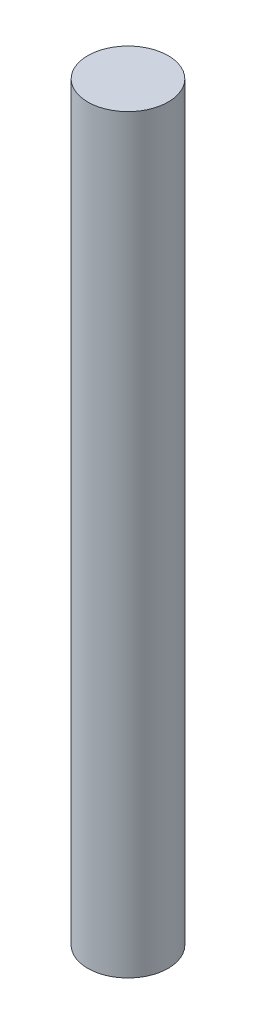
ISO-10303-21;
HEADER;
FILE_DESCRIPTION(('STEP AP214'),'2;1');
FILE_NAME('part.step','',(''),(''),'','','');
FILE_SCHEMA(('AUTOMOTIVE_DESIGN { 1 0 10303 214 1 1 1 1 }'));
ENDSEC;
DATA;
#1=APPLICATION_CONTEXT('core data for automotive mechanical design processes');
#2=APPLICATION_PROTOCOL_DEFINITION('international standard','automotive_design',2000,#1);
#3=PRODUCT_CONTEXT('',#1,'mechanical');
#4=PRODUCT('Part','Part','',(#3));
#5=PRODUCT_RELATED_PRODUCT_CATEGORY('part','',(#4));
#6=PRODUCT_DEFINITION_FORMATION('','',#4);
#7=PRODUCT_DEFINITION_CONTEXT('part definition',#1,'design');
#8=PRODUCT_DEFINITION('design','',#6,#7);
#9=PRODUCT_DEFINITION_SHAPE('','',#8);
#10=(LENGTH_UNIT() NAMED_UNIT(*) SI_UNIT(.MILLI.,.METRE.));
#11=(NAMED_UNIT(*) PLANE_ANGLE_UNIT() SI_UNIT($,.RADIAN.));
#12=(NAMED_UNIT(*) SI_UNIT($,.STERADIAN.) SOLID_ANGLE_UNIT());
#13=UNCERTAINTY_MEASURE_WITH_UNIT(LENGTH_MEASURE(1.E-05),#10,'distance_accuracy_value','');
#14=(GEOMETRIC_REPRESENTATION_CONTEXT(3) GLOBAL_UNCERTAINTY_ASSIGNED_CONTEXT((#13)) GLOBAL_UNIT_ASSIGNED_CONTEXT((#10,
#11,#12)) REPRESENTATION_CONTEXT('',''));
#15=CARTESIAN_POINT('',(0.,0.,0.));
#16=DIRECTION('',(0.,0.,1.));
#17=DIRECTION('',(1.,0.,0.));
#18=AXIS2_PLACEMENT_3D('',#15,#16,#17);
#19=CARTESIAN_POINT('',(0.,28.,0.));
#20=DIRECTION('',(0.,-1.,0.));
#21=DIRECTION('',(0.,0.,-1.));
#22=AXIS2_PLACEMENT_3D('',#19,#20,#21);
#23=CYLINDRICAL_SURFACE('',#22,1.5);
#24=CARTESIAN_POINT('',(0.,28.,0.));
#25=DIRECTION('',(0.,1.,0.));
#26=DIRECTION('',(0.,0.,1.));
#27=AXIS2_PLACEMENT_3D('',#24,#25,#26);
#28=CIRCLE('',#27,1.5);
#29=CARTESIAN_POINT('',(0.,28.,1.5));
#30=VERTEX_POINT('',#29);
#31=EDGE_CURVE('E10',#30,#30,#28,.T.);
#32=ORIENTED_EDGE('',*,*,#31,.F.);
#33=EDGE_LOOP('',(#32));
#34=FACE_BOUND('',#33,.T.);
#35=CARTESIAN_POINT('',(0.,0.,0.));
#36=DIRECTION('',(0.,1.,0.));
#37=DIRECTION('',(0.,0.,1.));
#38=AXIS2_PLACEMENT_3D('',#35,#36,#37);
#39=CIRCLE('',#38,1.5);
#40=CARTESIAN_POINT('',(0.,0.,1.5));
#41=VERTEX_POINT('',#40);
#42=EDGE_CURVE('E45',#41,#41,#39,.T.);
#43=ORIENTED_EDGE('',*,*,#42,.T.);
#44=EDGE_LOOP('',(#43));
#45=FACE_BOUND('',#44,.T.);
#46=ADVANCED_FACE('F39',(#34,#45),#23,.T.);
#47=CARTESIAN_POINT('',(0.,28.,0.));
#48=DIRECTION('',(0.,1.,0.));
#49=DIRECTION('',(0.,0.,1.));
#50=AXIS2_PLACEMENT_3D('',#47,#48,#49);
#51=PLANE('',#50);
#52=ORIENTED_EDGE('',*,*,#31,.T.);
#53=EDGE_LOOP('',(#52));
#54=FACE_BOUND('',#53,.T.);
#55=ADVANCED_FACE('F53',(#54),#51,.T.);
#56=CARTESIAN_POINT('',(0.,0.,0.));
#57=DIRECTION('',(0.,1.,0.));
#58=DIRECTION('',(0.,0.,1.));
#59=AXIS2_PLACEMENT_3D('',#56,#57,#58);
#60=PLANE('',#59);
#61=ORIENTED_EDGE('',*,*,#42,.F.);
#62=EDGE_LOOP('',(#61));
#63=FACE_BOUND('',#62,.T.);
#64=ADVANCED_FACE('F55',(#63),#60,.F.);
#65=CLOSED_SHELL('',(#46,#55,#64));
#66=MANIFOLD_SOLID_BREP('B2',#65);
#67=ADVANCED_BREP_SHAPE_REPRESENTATION('',(#18,#66),#14);
#68=SHAPE_DEFINITION_REPRESENTATION(#9,#67);
ENDSEC;
END-ISO-10303-21;
